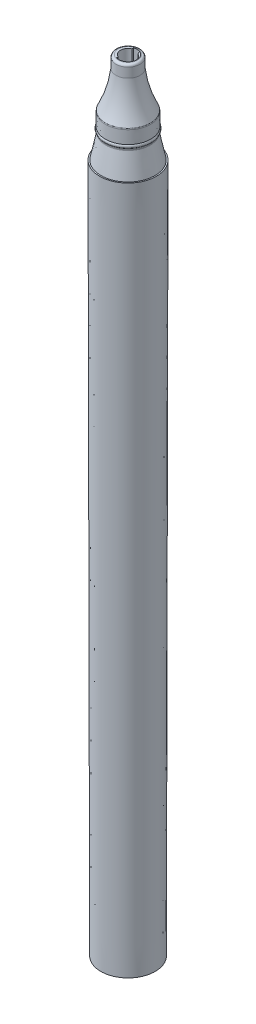
ISO-10303-21;
HEADER;
FILE_DESCRIPTION(('STEP AP214'),'2;1');
FILE_NAME('part.step','',(''),(''),'','','');
FILE_SCHEMA(('AUTOMOTIVE_DESIGN { 1 0 10303 214 1 1 1 1 }'));
ENDSEC;
DATA;
#1=APPLICATION_CONTEXT('core data for automotive mechanical design processes');
#2=APPLICATION_PROTOCOL_DEFINITION('international standard','automotive_design',2000,#1);
#3=PRODUCT_CONTEXT('',#1,'mechanical');
#4=PRODUCT('Part','Part','',(#3));
#5=PRODUCT_RELATED_PRODUCT_CATEGORY('part','',(#4));
#6=PRODUCT_DEFINITION_FORMATION('','',#4);
#7=PRODUCT_DEFINITION_CONTEXT('part definition',#1,'design');
#8=PRODUCT_DEFINITION('design','',#6,#7);
#9=PRODUCT_DEFINITION_SHAPE('','',#8);
#10=(LENGTH_UNIT() NAMED_UNIT(*) SI_UNIT(.MILLI.,.METRE.));
#11=(NAMED_UNIT(*) PLANE_ANGLE_UNIT() SI_UNIT($,.RADIAN.));
#12=(NAMED_UNIT(*) SI_UNIT($,.STERADIAN.) SOLID_ANGLE_UNIT());
#13=UNCERTAINTY_MEASURE_WITH_UNIT(LENGTH_MEASURE(1.E-05),#10,'distance_accuracy_value','');
#14=(GEOMETRIC_REPRESENTATION_CONTEXT(3) GLOBAL_UNCERTAINTY_ASSIGNED_CONTEXT((#13)) GLOBAL_UNIT_ASSIGNED_CONTEXT((#10,
#11,#12)) REPRESENTATION_CONTEXT('',''));
#15=CARTESIAN_POINT('',(0.,0.,0.));
#16=DIRECTION('',(0.,0.,1.));
#17=DIRECTION('',(1.,0.,0.));
#18=AXIS2_PLACEMENT_3D('',#15,#16,#17);
#19=CARTESIAN_POINT('',(29.567816034279,0.00621231461375715,0.));
#20=DIRECTION('',(0.,-1.,0.));
#21=DIRECTION('',(0.,0.,-1.));
#22=AXIS2_PLACEMENT_3D('',#19,#20,#21);
#23=CYLINDRICAL_SURFACE('',#22,1.49999999998157);
#24=DIRECTION('',(0.,1.,0.));
#25=VECTOR('',#24,1.);
#26=CARTESIAN_POINT('',(29.067816034279,127.906212314614,1.41421356237309));
#27=LINE('',#26,#25);
#28=CARTESIAN_POINT('',(29.067816034279,127.906212314981,1.41421356235355));
#29=VERTEX_POINT('',#28);
#30=CARTESIAN_POINT('',(29.0678160342851,129.906212314614,1.41421356235572));
#31=VERTEX_POINT('',#30);
#32=EDGE_CURVE('E155',#29,#31,#27,.T.);
#33=ORIENTED_EDGE('',*,*,#32,.T.);
#34=CARTESIAN_POINT('',(29.567816034279,129.906212314614,0.));
#35=DIRECTION('',(0.,-1.,0.));
#36=DIRECTION('',(0.,0.,-1.));
#37=AXIS2_PLACEMENT_3D('',#34,#35,#36);
#38=CIRCLE('',#37,1.49999999998157);
#39=CARTESIAN_POINT('',(30.067816034279,129.906212314614,1.41421356235355));
#40=VERTEX_POINT('',#39);
#41=EDGE_CURVE('E359',#40,#31,#38,.T.);
#42=ORIENTED_EDGE('',*,*,#41,.F.);
#43=DIRECTION('',(0.,1.,0.));
#44=VECTOR('',#43,1.);
#45=CARTESIAN_POINT('',(30.067816034279,127.906212314614,1.41421356237309));
#46=LINE('',#45,#44);
#47=CARTESIAN_POINT('',(30.067816034279,127.906212314614,1.41421356237309));
#48=VERTEX_POINT('',#47);
#49=EDGE_CURVE('E180',#48,#40,#46,.T.);
#50=ORIENTED_EDGE('',*,*,#49,.F.);
#51=CARTESIAN_POINT('',(29.567816034279,127.906212314981,0.));
#52=DIRECTION('',(0.,-1.,0.));
#53=DIRECTION('',(0.,0.,-1.));
#54=AXIS2_PLACEMENT_3D('',#51,#52,#53);
#55=CIRCLE('',#54,1.49999999998157);
#56=EDGE_CURVE('E360',#48,#29,#55,.T.);
#57=ORIENTED_EDGE('',*,*,#56,.T.);
#58=EDGE_LOOP('',(#33,#42,#50,#57));
#59=FACE_BOUND('',#58,.T.);
#60=ADVANCED_FACE('F41',(#59),#23,.F.);
#61=CARTESIAN_POINT('',(29.567816034279,114.236212314614,0.));
#62=DIRECTION('',(0.,1.,0.));
#63=DIRECTION('',(0.,0.,1.));
#64=AXIS2_PLACEMENT_3D('',#61,#62,#63);
#65=CONICAL_SURFACE('',#64,3.17500000000003,0.00418365950988951);
#66=CARTESIAN_POINT('',(29.567816034279,121.910496937969,0.));
#67=DIRECTION('',(0.,-1.,0.));
#68=DIRECTION('',(0.,0.,-1.));
#69=AXIS2_PLACEMENT_3D('',#66,#67,#68);
#70=CIRCLE('',#69,3.20710678116809);
#71=CARTESIAN_POINT('',(29.567816034279,121.910496937969,-3.20710678116809));
#72=VERTEX_POINT('',#71);
#73=EDGE_CURVE('E175',#72,#72,#70,.T.);
#74=ORIENTED_EDGE('',*,*,#73,.F.);
#75=EDGE_LOOP('',(#74));
#76=FACE_BOUND('',#75,.T.);
#77=CARTESIAN_POINT('',(29.567816034279,114.236212314614,0.));
#78=DIRECTION('',(0.,-1.,0.));
#79=DIRECTION('',(0.,0.,-1.));
#80=AXIS2_PLACEMENT_3D('',#77,#78,#79);
#81=CIRCLE('',#80,3.17500000000003);
#82=CARTESIAN_POINT('',(29.567816034279,114.236212314614,-3.17500000000003));
#83=VERTEX_POINT('',#82);
#84=EDGE_CURVE('E382',#83,#83,#81,.T.);
#85=ORIENTED_EDGE('',*,*,#84,.T.);
#86=EDGE_LOOP('',(#85));
#87=FACE_BOUND('',#86,.T.);
#88=ADVANCED_FACE('F300',(#76,#87),#65,.F.);
#89=CARTESIAN_POINT('',(29.567816034279,16.5861917853782,0.));
#90=DIRECTION('',(0.,-1.,0.));
#91=DIRECTION('',(0.,0.,-1.));
#92=AXIS2_PLACEMENT_3D('',#89,#90,#91);
#93=CONICAL_SURFACE('',#92,3.31000000000003,0.00138248730784819);
#94=ORIENTED_EDGE('',*,*,#84,.F.);
#95=EDGE_LOOP('',(#94));
#96=FACE_BOUND('',#95,.T.);
#97=CARTESIAN_POINT('',(29.567816034279,16.5861917853782,0.));
#98=DIRECTION('',(0.,-1.,0.));
#99=DIRECTION('',(0.,0.,-1.));
#100=AXIS2_PLACEMENT_3D('',#97,#98,#99);
#101=CIRCLE('',#100,3.31000000000003);
#102=CARTESIAN_POINT('',(29.567816034279,16.5861917853782,-3.31000000000003));
#103=VERTEX_POINT('',#102);
#104=EDGE_CURVE('E387',#103,#103,#101,.T.);
#105=ORIENTED_EDGE('',*,*,#104,.T.);
#106=EDGE_LOOP('',(#105));
#107=FACE_BOUND('',#106,.T.);
#108=ADVANCED_FACE('F296',(#96,#107),#93,.F.);
#109=CARTESIAN_POINT('',(29.567816034279,11.1062123146138,0.));
#110=DIRECTION('',(0.,-1.,0.));
#111=DIRECTION('',(0.,0.,-1.));
#112=AXIS2_PLACEMENT_3D('',#109,#110,#111);
#113=CONICAL_SURFACE('',#112,3.32500000000002,0.00273722969545193);
#114=ORIENTED_EDGE('',*,*,#104,.F.);
#115=EDGE_LOOP('',(#114));
#116=FACE_BOUND('',#115,.T.);
#117=CARTESIAN_POINT('',(29.567816034279,11.1062123146138,0.));
#118=DIRECTION('',(0.,-1.,0.));
#119=DIRECTION('',(0.,0.,-1.));
#120=AXIS2_PLACEMENT_3D('',#117,#118,#119);
#121=CIRCLE('',#120,3.32500000000002);
#122=CARTESIAN_POINT('',(29.567816034279,11.1062123146138,-3.32500000000002));
#123=VERTEX_POINT('',#122);
#124=EDGE_CURVE('E393',#123,#123,#121,.T.);
#125=ORIENTED_EDGE('',*,*,#124,.T.);
#126=EDGE_LOOP('',(#125));
#127=FACE_BOUND('',#126,.T.);
#128=ADVANCED_FACE('F292',(#116,#127),#113,.F.);
#129=CARTESIAN_POINT('',(0.,11.1062123146138,0.));
#130=DIRECTION('',(0.,1.,0.));
#131=DIRECTION('',(0.,0.,1.));
#132=AXIS2_PLACEMENT_3D('',#129,#130,#131);
#133=PLANE('',#132);
#134=ORIENTED_EDGE('',*,*,#124,.F.);
#135=EDGE_LOOP('',(#134));
#136=FACE_BOUND('',#135,.T.);
#137=CARTESIAN_POINT('',(29.567816034279,11.1062123146138,0.));
#138=DIRECTION('',(0.,-1.,0.));
#139=DIRECTION('',(0.,0.,-1.));
#140=AXIS2_PLACEMENT_3D('',#137,#138,#139);
#141=CIRCLE('',#140,3.39000000000003);
#142=CARTESIAN_POINT('',(29.567816034279,11.1062123146138,-3.39000000000003));
#143=VERTEX_POINT('',#142);
#144=EDGE_CURVE('E397',#143,#143,#141,.T.);
#145=ORIENTED_EDGE('',*,*,#144,.T.);
#146=EDGE_LOOP('',(#145));
#147=FACE_BOUND('',#146,.T.);
#148=ADVANCED_FACE('F288',(#136,#147),#133,.F.);
#149=CARTESIAN_POINT('',(29.567816034279,0.00621231461375715,0.));
#150=DIRECTION('',(0.,-1.,0.));
#151=DIRECTION('',(0.,0.,-1.));
#152=AXIS2_PLACEMENT_3D('',#149,#150,#151);
#153=CYLINDRICAL_SURFACE('',#152,3.39000000000003);
#154=ORIENTED_EDGE('',*,*,#144,.F.);
#155=EDGE_LOOP('',(#154));
#156=FACE_BOUND('',#155,.T.);
#157=CARTESIAN_POINT('',(29.567816034279,8.5062123146139,0.));
#158=DIRECTION('',(0.,-1.,0.));
#159=DIRECTION('',(0.,0.,-1.));
#160=AXIS2_PLACEMENT_3D('',#157,#158,#159);
#161=CIRCLE('',#160,3.39000000000003);
#162=CARTESIAN_POINT('',(29.567816034279,8.5062123146139,-3.39000000000003));
#163=VERTEX_POINT('',#162);
#164=EDGE_CURVE('E401',#163,#163,#161,.T.);
#165=ORIENTED_EDGE('',*,*,#164,.T.);
#166=EDGE_LOOP('',(#165));
#167=FACE_BOUND('',#166,.T.);
#168=ADVANCED_FACE('F284',(#156,#167),#153,.F.);
#169=CARTESIAN_POINT('',(0.,8.5062123146139,0.));
#170=DIRECTION('',(0.,-1.,0.));
#171=DIRECTION('',(0.,0.,-1.));
#172=AXIS2_PLACEMENT_3D('',#169,#170,#171);
#173=PLANE('',#172);
#174=ORIENTED_EDGE('',*,*,#164,.F.);
#175=EDGE_LOOP('',(#174));
#176=FACE_BOUND('',#175,.T.);
#177=CARTESIAN_POINT('',(29.567816034279,8.5062123146139,0.));
#178=DIRECTION('',(0.,-1.,0.));
#179=DIRECTION('',(0.,0.,-1.));
#180=AXIS2_PLACEMENT_3D('',#177,#178,#179);
#181=CIRCLE('',#180,3.32500000000002);
#182=CARTESIAN_POINT('',(29.567816034279,8.5062123146139,-3.32500000000002));
#183=VERTEX_POINT('',#182);
#184=EDGE_CURVE('E405',#183,#183,#181,.T.);
#185=ORIENTED_EDGE('',*,*,#184,.T.);
#186=EDGE_LOOP('',(#185));
#187=FACE_BOUND('',#186,.T.);
#188=ADVANCED_FACE('F280',(#176,#187),#173,.F.);
#189=CARTESIAN_POINT('',(29.567816034279,0.00621231461375715,0.));
#190=DIRECTION('',(0.,-1.,0.));
#191=DIRECTION('',(0.,0.,-1.));
#192=AXIS2_PLACEMENT_3D('',#189,#190,#191);
#193=CYLINDRICAL_SURFACE('',#192,3.32500000000002);
#194=ORIENTED_EDGE('',*,*,#184,.F.);
#195=EDGE_LOOP('',(#194));
#196=FACE_BOUND('',#195,.T.);
#197=CARTESIAN_POINT('',(29.567816034279,5.80621231461376,0.));
#198=DIRECTION('',(0.,-1.,0.));
#199=DIRECTION('',(0.,0.,-1.));
#200=AXIS2_PLACEMENT_3D('',#197,#198,#199);
#201=CIRCLE('',#200,3.32500000000002);
#202=CARTESIAN_POINT('',(29.567816034279,5.80621231461376,-3.32500000000002));
#203=VERTEX_POINT('',#202);
#204=EDGE_CURVE('E409',#203,#203,#201,.T.);
#205=ORIENTED_EDGE('',*,*,#204,.T.);
#206=EDGE_LOOP('',(#205));
#207=FACE_BOUND('',#206,.T.);
#208=ADVANCED_FACE('F276',(#196,#207),#193,.F.);
#209=CARTESIAN_POINT('',(0.,5.80621231461376,0.));
#210=DIRECTION('',(0.,1.,0.));
#211=DIRECTION('',(0.,0.,1.));
#212=AXIS2_PLACEMENT_3D('',#209,#210,#211);
#213=PLANE('',#212);
#214=ORIENTED_EDGE('',*,*,#204,.F.);
#215=EDGE_LOOP('',(#214));
#216=FACE_BOUND('',#215,.T.);
#217=CARTESIAN_POINT('',(29.567816034279,5.80621231461376,0.));
#218=DIRECTION('',(0.,-1.,0.));
#219=DIRECTION('',(0.,0.,-1.));
#220=AXIS2_PLACEMENT_3D('',#217,#218,#219);
#221=CIRCLE('',#220,3.39000000000003);
#222=CARTESIAN_POINT('',(29.567816034279,5.80621231461376,-3.39000000000003));
#223=VERTEX_POINT('',#222);
#224=EDGE_CURVE('E413',#223,#223,#221,.T.);
#225=ORIENTED_EDGE('',*,*,#224,.T.);
#226=EDGE_LOOP('',(#225));
#227=FACE_BOUND('',#226,.T.);
#228=ADVANCED_FACE('F272',(#216,#227),#213,.F.);
#229=CARTESIAN_POINT('',(29.567816034279,0.00621231461375715,0.));
#230=DIRECTION('',(0.,-1.,0.));
#231=DIRECTION('',(0.,0.,-1.));
#232=AXIS2_PLACEMENT_3D('',#229,#230,#231);
#233=CYLINDRICAL_SURFACE('',#232,3.39000000000003);
#234=ORIENTED_EDGE('',*,*,#224,.F.);
#235=EDGE_LOOP('',(#234));
#236=FACE_BOUND('',#235,.T.);
#237=CARTESIAN_POINT('',(29.567816034279,3.20621231461392,0.));
#238=DIRECTION('',(0.,-1.,0.));
#239=DIRECTION('',(0.,0.,-1.));
#240=AXIS2_PLACEMENT_3D('',#237,#238,#239);
#241=CIRCLE('',#240,3.39000000000003);
#242=CARTESIAN_POINT('',(29.567816034279,3.20621231461392,-3.39000000000003));
#243=VERTEX_POINT('',#242);
#244=EDGE_CURVE('E417',#243,#243,#241,.T.);
#245=ORIENTED_EDGE('',*,*,#244,.T.);
#246=EDGE_LOOP('',(#245));
#247=FACE_BOUND('',#246,.T.);
#248=ADVANCED_FACE('F268',(#236,#247),#233,.F.);
#249=CARTESIAN_POINT('',(0.,3.20621231461392,0.));
#250=DIRECTION('',(0.,-1.,0.));
#251=DIRECTION('',(0.,0.,-1.));
#252=AXIS2_PLACEMENT_3D('',#249,#250,#251);
#253=PLANE('',#252);
#254=ORIENTED_EDGE('',*,*,#244,.F.);
#255=EDGE_LOOP('',(#254));
#256=FACE_BOUND('',#255,.T.);
#257=CARTESIAN_POINT('',(29.567816034279,3.20621231461392,0.));
#258=DIRECTION('',(0.,-1.,0.));
#259=DIRECTION('',(0.,0.,-1.));
#260=AXIS2_PLACEMENT_3D('',#257,#258,#259);
#261=CIRCLE('',#260,3.35000000000002);
#262=CARTESIAN_POINT('',(29.567816034279,3.20621231461392,-3.35000000000002));
#263=VERTEX_POINT('',#262);
#264=EDGE_CURVE('E421',#263,#263,#261,.T.);
#265=ORIENTED_EDGE('',*,*,#264,.T.);
#266=EDGE_LOOP('',(#265));
#267=FACE_BOUND('',#266,.T.);
#268=ADVANCED_FACE('F264',(#256,#267),#253,.F.);
#269=CARTESIAN_POINT('',(29.567816034279,0.00621231461375715,0.));
#270=DIRECTION('',(0.,-1.,0.));
#271=DIRECTION('',(0.,0.,-1.));
#272=AXIS2_PLACEMENT_3D('',#269,#270,#271);
#273=CYLINDRICAL_SURFACE('',#272,3.35000000000002);
#274=ORIENTED_EDGE('',*,*,#264,.F.);
#275=EDGE_LOOP('',(#274));
#276=FACE_BOUND('',#275,.T.);
#277=CARTESIAN_POINT('',(29.567816034279,0.50621231461391,0.));
#278=DIRECTION('',(0.,-1.,0.));
#279=DIRECTION('',(0.,0.,-1.));
#280=AXIS2_PLACEMENT_3D('',#277,#278,#279);
#281=CIRCLE('',#280,3.35000000000002);
#282=CARTESIAN_POINT('',(29.567816034279,0.50621231461391,-3.35000000000002));
#283=VERTEX_POINT('',#282);
#284=EDGE_CURVE('E425',#283,#283,#281,.T.);
#285=ORIENTED_EDGE('',*,*,#284,.T.);
#286=EDGE_LOOP('',(#285));
#287=FACE_BOUND('',#286,.T.);
#288=ADVANCED_FACE('F260',(#276,#287),#273,.F.);
#289=CARTESIAN_POINT('',(0.,0.50621231461391,0.));
#290=DIRECTION('',(0.,-1.,0.));
#291=DIRECTION('',(0.,0.,-1.));
#292=AXIS2_PLACEMENT_3D('',#289,#290,#291);
#293=PLANE('',#292);
#294=CARTESIAN_POINT('',(29.567816034279,0.50621231461391,0.));
#295=DIRECTION('',(0.,-1.,0.));
#296=DIRECTION('',(0.,0.,-1.));
#297=AXIS2_PLACEMENT_3D('',#294,#295,#296);
#298=CIRCLE('',#297,3.92500000000003);
#299=CARTESIAN_POINT('',(29.567816034279,0.50621231461391,-3.92500000000003));
#300=VERTEX_POINT('',#299);
#301=EDGE_CURVE('E429',#300,#300,#298,.T.);
#302=ORIENTED_EDGE('',*,*,#301,.T.);
#303=EDGE_LOOP('',(#302));
#304=FACE_BOUND('',#303,.T.);
#305=ORIENTED_EDGE('',*,*,#284,.F.);
#306=EDGE_LOOP('',(#305));
#307=FACE_BOUND('',#306,.T.);
#308=ADVANCED_FACE('F256',(#304,#307),#293,.T.);
#309=CARTESIAN_POINT('',(29.567816034279,0.50621231461391,0.));
#310=DIRECTION('',(0.,-1.,0.));
#311=DIRECTION('',(0.,0.,-1.));
#312=AXIS2_PLACEMENT_3D('',#309,#310,#311);
#313=CONICAL_SURFACE('',#312,3.92500000000003,0.0523598775597028);
#314=CARTESIAN_POINT('',(29.567816034279,0.000953551691870738,0.));
#315=DIRECTION('',(0.,-1.,0.));
#316=DIRECTION('',(0.,0.,-1.));
#317=AXIS2_PLACEMENT_3D('',#314,#315,#316);
#318=CIRCLE('',#317,3.95147948972801);
#319=CARTESIAN_POINT('',(29.567816034279,0.000953551691870738,-3.95147948972801));
#320=VERTEX_POINT('',#319);
#321=EDGE_CURVE('E433',#320,#320,#318,.T.);
#322=ORIENTED_EDGE('',*,*,#321,.T.);
#323=EDGE_LOOP('',(#322));
#324=FACE_BOUND('',#323,.T.);
#325=ORIENTED_EDGE('',*,*,#301,.F.);
#326=EDGE_LOOP('',(#325));
#327=FACE_BOUND('',#326,.T.);
#328=ADVANCED_FACE('F252',(#324,#327),#313,.F.);
#329=CARTESIAN_POINT('',(29.567816034279,0.000953551691870738,0.));
#330=DIRECTION('',(0.,-1.,0.));
#331=DIRECTION('',(0.,0.,-1.));
#332=AXIS2_PLACEMENT_3D('',#329,#330,#331);
#333=CONICAL_SURFACE('',#332,3.95147948972801,1.56913369572546);
#334=CARTESIAN_POINT('',(29.567816034279,-3.67220143182578E-10,0.));
#335=DIRECTION('',(0.,-1.,0.));
#336=DIRECTION('',(0.,0.,-1.));
#337=AXIS2_PLACEMENT_3D('',#334,#335,#336);
#338=CIRCLE('',#337,4.524998893986);
#339=CARTESIAN_POINT('',(29.567816034279,-3.67220143182578E-10,-4.524998893986));
#340=VERTEX_POINT('',#339);
#341=EDGE_CURVE('E437',#340,#340,#338,.T.);
#342=ORIENTED_EDGE('',*,*,#341,.T.);
#343=EDGE_LOOP('',(#342));
#344=FACE_BOUND('',#343,.T.);
#345=ORIENTED_EDGE('',*,*,#321,.F.);
#346=EDGE_LOOP('',(#345));
#347=FACE_BOUND('',#346,.T.);
#348=ADVANCED_FACE('F248',(#344,#347),#333,.F.);
#349=CARTESIAN_POINT('',(29.567816034279,-3.67220143182578E-10,0.));
#350=DIRECTION('',(0.,1.,0.));
#351=DIRECTION('',(0.,0.,1.));
#352=AXIS2_PLACEMENT_3D('',#349,#350,#351);
#353=CONICAL_SURFACE('',#352,4.524998893986,0.00166263106943584);
#354=CARTESIAN_POINT('',(29.567816034279,114.706212314614,0.));
#355=DIRECTION('',(0.,-1.,0.));
#356=DIRECTION('',(0.,0.,-1.));
#357=AXIS2_PLACEMENT_3D('',#354,#355,#356);
#358=CIRCLE('',#357,4.7157131821714);
#359=CARTESIAN_POINT('',(29.567816034279,114.706212314614,-4.7157131821714));
#360=VERTEX_POINT('',#359);
#361=EDGE_CURVE('E441',#360,#360,#358,.T.);
#362=ORIENTED_EDGE('',*,*,#361,.T.);
#363=EDGE_LOOP('',(#362));
#364=FACE_BOUND('',#363,.T.);
#365=ORIENTED_EDGE('',*,*,#341,.F.);
#366=EDGE_LOOP('',(#365));
#367=FACE_BOUND('',#366,.T.);
#368=ADVANCED_FACE('F244',(#364,#367),#353,.T.);
#369=CARTESIAN_POINT('',(0.,114.706212314614,0.));
#370=DIRECTION('',(0.,-1.,0.));
#371=DIRECTION('',(0.,0.,-1.));
#372=AXIS2_PLACEMENT_3D('',#369,#370,#371);
#373=PLANE('',#372);
#374=CARTESIAN_POINT('',(29.567816034279,114.706212314614,0.));
#375=DIRECTION('',(0.,-1.,0.));
#376=DIRECTION('',(0.,0.,-1.));
#377=AXIS2_PLACEMENT_3D('',#374,#375,#376);
#378=CIRCLE('',#377,4.49839647045024);
#379=CARTESIAN_POINT('',(29.567816034279,114.706212314614,-4.49839647045024));
#380=VERTEX_POINT('',#379);
#381=EDGE_CURVE('E51',#380,#380,#378,.T.);
#382=ORIENTED_EDGE('',*,*,#381,.T.);
#383=EDGE_LOOP('',(#382));
#384=FACE_BOUND('',#383,.T.);
#385=ORIENTED_EDGE('',*,*,#361,.F.);
#386=EDGE_LOOP('',(#385));
#387=FACE_BOUND('',#386,.T.);
#388=ADVANCED_FACE('F240',(#384,#387),#373,.F.);
#389=CARTESIAN_POINT('',(29.567816034279,113.95974147737,0.));
#390=DIRECTION('',(0.,-1.,0.));
#391=DIRECTION('',(0.,0.,-1.));
#392=AXIS2_PLACEMENT_3D('',#389,#390,#391);
#393=DEGENERATE_TOROIDAL_SURFACE('',#392,71.1713068215919,75.,.F.);
#394=CARTESIAN_POINT('',(29.567816034279,118.662812367333,0.));
#395=DIRECTION('',(0.,-1.,0.));
#396=DIRECTION('',(0.,0.,-1.));
#397=AXIS2_PLACEMENT_3D('',#394,#395,#396);
#398=CIRCLE('',#397,3.68108875933782);
#399=CARTESIAN_POINT('',(29.567816034279,118.662812367333,-3.68108875933782));
#400=VERTEX_POINT('',#399);
#401=EDGE_CURVE('E11',#400,#400,#398,.F.);
#402=ORIENTED_EDGE('',*,*,#401,.T.);
#403=EDGE_LOOP('',(#402));
#404=FACE_BOUND('',#403,.T.);
#405=CARTESIAN_POINT('',(29.567816034279,118.745733306266,0.));
#406=DIRECTION('',(0.,-1.,0.));
#407=DIRECTION('',(0.,0.,-1.));
#408=AXIS2_PLACEMENT_3D('',#405,#406,#407);
#409=CIRCLE('',#408,3.6758326174926);
#410=CARTESIAN_POINT('',(29.567816034279,118.745733306266,-3.6758326174926));
#411=VERTEX_POINT('',#410);
#412=EDGE_CURVE('E445',#411,#411,#409,.T.);
#413=ORIENTED_EDGE('',*,*,#412,.T.);
#414=EDGE_LOOP('',(#413));
#415=FACE_BOUND('',#414,.T.);
#416=ADVANCED_FACE('F236',(#404,#415),#393,.F.);
#417=CARTESIAN_POINT('',(29.567816034279,118.771258596021,0.));
#418=DIRECTION('',(0.,-1.,0.));
#419=DIRECTION('',(0.,0.,-1.));
#420=AXIS2_PLACEMENT_3D('',#417,#418,#419);
#421=TOROIDAL_SURFACE('',#420,4.07501736118282,0.400000000015133);
#422=ORIENTED_EDGE('',*,*,#412,.F.);
#423=EDGE_LOOP('',(#422));
#424=FACE_BOUND('',#423,.T.);
#425=CARTESIAN_POINT('',(29.567816034279,119.039806822496,0.));
#426=DIRECTION('',(0.,-1.,0.));
#427=DIRECTION('',(0.,0.,-1.));
#428=AXIS2_PLACEMENT_3D('',#425,#426,#427);
#429=CIRCLE('',#428,3.77856863025525);
#430=CARTESIAN_POINT('',(29.567816034279,119.039806822496,-3.77856863025525));
#431=VERTEX_POINT('',#430);
#432=EDGE_CURVE('E449',#431,#431,#429,.T.);
#433=ORIENTED_EDGE('',*,*,#432,.T.);
#434=EDGE_LOOP('',(#433));
#435=FACE_BOUND('',#434,.T.);
#436=ADVANCED_FACE('F232',(#424,#435),#421,.F.);
#437=CARTESIAN_POINT('',(29.567816034279,119.30835504882,0.));
#438=DIRECTION('',(0.,-1.,0.));
#439=DIRECTION('',(0.,0.,-1.));
#440=AXIS2_PLACEMENT_3D('',#437,#438,#439);
#441=TOROIDAL_SURFACE('',#440,3.48211989921324,0.399999999998108);
#442=ORIENTED_EDGE('',*,*,#432,.F.);
#443=EDGE_LOOP('',(#442));
#444=FACE_BOUND('',#443,.T.);
#445=CARTESIAN_POINT('',(29.567816034279,119.583193369398,0.));
#446=DIRECTION('',(0.,-1.,0.));
#447=DIRECTION('',(0.,0.,-1.));
#448=AXIS2_PLACEMENT_3D('',#445,#446,#447);
#449=CIRCLE('',#448,3.77274663153745);
#450=CARTESIAN_POINT('',(29.567816034279,119.583193369398,-3.77274663153745));
#451=VERTEX_POINT('',#450);
#452=EDGE_CURVE('E453',#451,#451,#449,.T.);
#453=ORIENTED_EDGE('',*,*,#452,.T.);
#454=EDGE_LOOP('',(#453));
#455=FACE_BOUND('',#454,.T.);
#456=ADVANCED_FACE('F228',(#444,#455),#441,.T.);
#457=CARTESIAN_POINT('',(29.567816034279,121.706212314614,0.));
#458=DIRECTION('',(0.,-1.,0.));
#459=DIRECTION('',(0.,0.,-1.));
#460=AXIS2_PLACEMENT_3D('',#457,#458,#459);
#461=CONICAL_SURFACE('',#460,3.74999999998154,0.0107138757571123);
#462=ORIENTED_EDGE('',*,*,#452,.F.);
#463=EDGE_LOOP('',(#462));
#464=FACE_BOUND('',#463,.T.);
#465=CARTESIAN_POINT('',(29.567816034279,121.706212314614,0.));
#466=DIRECTION('',(0.,-1.,0.));
#467=DIRECTION('',(0.,0.,-1.));
#468=AXIS2_PLACEMENT_3D('',#465,#466,#467);
#469=CIRCLE('',#468,3.74999999998154);
#470=CARTESIAN_POINT('',(29.567816034279,121.706212314614,-3.74999999998154));
#471=VERTEX_POINT('',#470);
#472=EDGE_CURVE('E457',#471,#471,#469,.T.);
#473=ORIENTED_EDGE('',*,*,#472,.T.);
#474=EDGE_LOOP('',(#473));
#475=FACE_BOUND('',#474,.T.);
#476=ADVANCED_FACE('F224',(#464,#475),#461,.T.);
#477=CARTESIAN_POINT('',(29.567816034279,121.707212364619,0.));
#478=DIRECTION('',(0.,-1.,0.));
#479=DIRECTION('',(0.,0.,-1.));
#480=AXIS2_PLACEMENT_3D('',#477,#478,#479);
#481=TOROIDAL_SURFACE('',#480,2.75000050003171,0.999999999999965);
#482=CARTESIAN_POINT('',(29.567816034279,121.906212314614,0.));
#483=DIRECTION('',(0.,-1.,0.));
#484=DIRECTION('',(0.,0.,-1.));
#485=AXIS2_PLACEMENT_3D('',#482,#483,#484);
#486=CIRCLE('',#485,3.72999999998155);
#487=CARTESIAN_POINT('',(29.567816034279,121.906212314614,-3.72999999998155));
#488=VERTEX_POINT('',#487);
#489=EDGE_CURVE('E461',#488,#488,#486,.T.);
#490=ORIENTED_EDGE('',*,*,#489,.T.);
#491=EDGE_LOOP('',(#490));
#492=FACE_BOUND('',#491,.T.);
#493=ORIENTED_EDGE('',*,*,#472,.F.);
#494=EDGE_LOOP('',(#493));
#495=FACE_BOUND('',#494,.T.);
#496=ADVANCED_FACE('F220',(#492,#495),#481,.T.);
#497=CARTESIAN_POINT('',(29.567816034279,129.791304012019,0.));
#498=DIRECTION('',(0.,-1.,0.));
#499=DIRECTION('',(0.,0.,-1.));
#500=AXIS2_PLACEMENT_3D('',#497,#498,#499);
#501=TOROIDAL_SURFACE('',#500,19.911017549059,18.0000000000007);
#502=ORIENTED_EDGE('',*,*,#489,.F.);
#503=EDGE_LOOP('',(#502));
#504=FACE_BOUND('',#503,.T.);
#505=CARTESIAN_POINT('',(29.567816034279,127.906212314614,0.));
#506=DIRECTION('',(0.,-1.,0.));
#507=DIRECTION('',(0.,0.,-1.));
#508=AXIS2_PLACEMENT_3D('',#505,#506,#507);
#509=CIRCLE('',#508,2.00999999998139);
#510=CARTESIAN_POINT('',(29.567816034279,127.906212314614,-2.00999999998139));
#511=VERTEX_POINT('',#510);
#512=EDGE_CURVE('E465',#511,#511,#509,.T.);
#513=ORIENTED_EDGE('',*,*,#512,.T.);
#514=EDGE_LOOP('',(#513));
#515=FACE_BOUND('',#514,.T.);
#516=ADVANCED_FACE('F216',(#504,#515),#501,.F.);
#517=CARTESIAN_POINT('',(29.567816034279,0.00621231461375715,0.));
#518=DIRECTION('',(0.,-1.,0.));
#519=DIRECTION('',(0.,0.,-1.));
#520=AXIS2_PLACEMENT_3D('',#517,#518,#519);
#521=CYLINDRICAL_SURFACE('',#520,2.00999999998148);
#522=CARTESIAN_POINT('',(29.567816034279,129.506212314614,0.));
#523=DIRECTION('',(0.,-1.,0.));
#524=DIRECTION('',(0.,0.,-1.));
#525=AXIS2_PLACEMENT_3D('',#522,#523,#524);
#526=CIRCLE('',#525,2.00999999998158);
#527=CARTESIAN_POINT('',(29.567816034279,129.506212314614,-2.00999999998158));
#528=VERTEX_POINT('',#527);
#529=EDGE_CURVE('E469',#528,#528,#526,.T.);
#530=ORIENTED_EDGE('',*,*,#529,.T.);
#531=EDGE_LOOP('',(#530));
#532=FACE_BOUND('',#531,.T.);
#533=ORIENTED_EDGE('',*,*,#512,.F.);
#534=EDGE_LOOP('',(#533));
#535=FACE_BOUND('',#534,.T.);
#536=ADVANCED_FACE('F212',(#532,#535),#521,.T.);
#537=CARTESIAN_POINT('',(29.567816034279,129.506212314614,0.));
#538=DIRECTION('',(0.,-1.,0.));
#539=DIRECTION('',(0.,0.,-1.));
#540=AXIS2_PLACEMENT_3D('',#537,#538,#539);
#541=TOROIDAL_SURFACE('',#540,1.60999999998157,0.400000000000011);
#542=CARTESIAN_POINT('',(29.567816034279,129.906212314614,0.));
#543=DIRECTION('',(0.,-1.,0.));
#544=DIRECTION('',(0.,0.,-1.));
#545=AXIS2_PLACEMENT_3D('',#542,#543,#544);
#546=CIRCLE('',#545,1.60999999998157);
#547=CARTESIAN_POINT('',(29.567816034279,129.906212314614,-1.60999999998157));
#548=VERTEX_POINT('',#547);
#549=EDGE_CURVE('E369',#548,#548,#546,.T.);
#550=ORIENTED_EDGE('',*,*,#549,.T.);
#551=EDGE_LOOP('',(#550));
#552=FACE_BOUND('',#551,.T.);
#553=ORIENTED_EDGE('',*,*,#529,.F.);
#554=EDGE_LOOP('',(#553));
#555=FACE_BOUND('',#554,.T.);
#556=ADVANCED_FACE('F208',(#552,#555),#541,.T.);
#557=CARTESIAN_POINT('',(0.,129.906212314614,0.));
#558=DIRECTION('',(0.,1.,0.));
#559=DIRECTION('',(0.,0.,1.));
#560=AXIS2_PLACEMENT_3D('',#557,#558,#559);
#561=PLANE('',#560);
#562=CARTESIAN_POINT('',(29.067816034279,129.906212314614,-1.41421356235355));
#563=VERTEX_POINT('',#562);
#564=CARTESIAN_POINT('',(30.0678160342728,129.906212314614,-1.41421356235572));
#565=VERTEX_POINT('',#564);
#566=EDGE_CURVE('E370',#563,#565,#38,.T.);
#567=ORIENTED_EDGE('',*,*,#566,.T.);
#568=CARTESIAN_POINT('',(29.567816034279,129.906212314614,0.));
#569=DIRECTION('',(0.,1.,0.));
#570=DIRECTION('',(0.,0.,1.));
#571=AXIS2_PLACEMENT_3D('',#568,#569,#570);
#572=CIRCLE('',#571,1.5);
#573=EDGE_CURVE('E367',#565,#40,#572,.F.);
#574=ORIENTED_EDGE('',*,*,#573,.T.);
#575=ORIENTED_EDGE('',*,*,#41,.T.);
#576=DIRECTION('',(0.,0.,-1.));
#577=VECTOR('',#576,1.);
#578=CARTESIAN_POINT('',(29.067816034279,129.906212314614,1.41421356237309));
#579=LINE('',#578,#577);
#580=CARTESIAN_POINT('',(29.067816034279,129.906212314614,1.14564392373896));
#581=VERTEX_POINT('',#580);
#582=EDGE_CURVE('E136',#31,#581,#579,.T.);
#583=ORIENTED_EDGE('',*,*,#582,.T.);
#584=CARTESIAN_POINT('',(29.567816034279,129.906212314614,0.));
#585=DIRECTION('',(0.,-1.,0.));
#586=DIRECTION('',(-1.,0.,0.));
#587=AXIS2_PLACEMENT_3D('',#584,#585,#586);
#588=CIRCLE('',#587,1.25);
#589=CARTESIAN_POINT('',(29.067816034279,129.906212314614,-1.14564392373896));
#590=VERTEX_POINT('',#589);
#591=EDGE_CURVE('E147',#581,#590,#588,.T.);
#592=ORIENTED_EDGE('',*,*,#591,.T.);
#593=DIRECTION('',(0.,0.,-1.));
#594=VECTOR('',#593,1.);
#595=CARTESIAN_POINT('',(29.067816034279,129.906212314614,-1.14564392373896));
#596=LINE('',#595,#594);
#597=EDGE_CURVE('E114',#590,#563,#596,.T.);
#598=ORIENTED_EDGE('',*,*,#597,.T.);
#599=EDGE_LOOP('',(#567,#574,#575,#583,#592,#598));
#600=FACE_BOUND('',#599,.T.);
#601=ORIENTED_EDGE('',*,*,#549,.F.);
#602=EDGE_LOOP('',(#601));
#603=FACE_BOUND('',#602,.T.);
#604=ADVANCED_FACE('F204',(#600,#603),#561,.T.);
#605=DIRECTION('',(0.,1.,0.));
#606=VECTOR('',#605,1.);
#607=CARTESIAN_POINT('',(29.067816034279,127.906212314614,-1.41421356237309));
#608=LINE('',#607,#606);
#609=CARTESIAN_POINT('',(29.067816034279,127.906212314614,-1.41421356237309));
#610=VERTEX_POINT('',#609);
#611=EDGE_CURVE('E120',#610,#563,#608,.T.);
#612=ORIENTED_EDGE('',*,*,#611,.F.);
#613=CARTESIAN_POINT('',(30.067816034279,127.906212314981,-1.41421356235355));
#614=VERTEX_POINT('',#613);
#615=EDGE_CURVE('E377',#610,#614,#55,.T.);
#616=ORIENTED_EDGE('',*,*,#615,.T.);
#617=DIRECTION('',(0.,1.,0.));
#618=VECTOR('',#617,1.);
#619=CARTESIAN_POINT('',(30.067816034279,127.906212314614,-1.41421356237309));
#620=LINE('',#619,#618);
#621=EDGE_CURVE('E176',#614,#565,#620,.T.);
#622=ORIENTED_EDGE('',*,*,#621,.T.);
#623=ORIENTED_EDGE('',*,*,#566,.F.);
#624=EDGE_LOOP('',(#612,#616,#622,#623));
#625=FACE_BOUND('',#624,.T.);
#626=ADVANCED_FACE('F199',(#625),#23,.F.);
#627=CARTESIAN_POINT('',(31.0678160342606,127.906212314981,0.));
#628=CARTESIAN_POINT('',(31.1596244141035,127.037730670578,0.));
#629=CARTESIAN_POINT('',(31.3928304258709,125.33067788015,0.));
#630=CARTESIAN_POINT('',(31.7252149418012,123.68344608648,0.));
#631=CARTESIAN_POINT('',(31.916201825807,122.874785438834,0.));
#632=B_SPLINE_CURVE_WITH_KNOTS('',3,(#627,#628,#629,#630,#631),.UNSPECIFIED.,.F.,.F.,(4,1,4),
(0.,0.486102122719795,0.97220424543959),.UNSPECIFIED.);
#633=CARTESIAN_POINT('',(29.567816034279,0.00621231461375715,0.));
#634=DIRECTION('',(0.,-1.,0.));
#635=AXIS1_PLACEMENT('',#633,#634);
#636=SURFACE_OF_REVOLUTION('',#632,#635);
#637=CARTESIAN_POINT('',(29.567816034279,122.874785438834,0.));
#638=DIRECTION('',(0.,-1.,0.));
#639=DIRECTION('',(0.,0.,-1.));
#640=AXIS2_PLACEMENT_3D('',#637,#638,#639);
#641=CIRCLE('',#640,2.34838579152805);
#642=CARTESIAN_POINT('',(29.567816034279,122.874785438834,-2.34838579152805));
#643=VERTEX_POINT('',#642);
#644=EDGE_CURVE('E479',#643,#643,#641,.T.);
#645=ORIENTED_EDGE('',*,*,#644,.T.);
#646=EDGE_LOOP('',(#645));
#647=FACE_BOUND('',#646,.T.);
#648=EDGE_CURVE('E375',#614,#48,#55,.T.);
#649=ORIENTED_EDGE('',*,*,#648,.F.);
#650=ORIENTED_EDGE('',*,*,#615,.F.);
#651=CARTESIAN_POINT('',(29.567816034279,127.906212314614,0.));
#652=DIRECTION('',(0.,1.,0.));
#653=DIRECTION('',(-1.,0.,0.));
#654=AXIS2_PLACEMENT_3D('',#651,#652,#653);
#655=CIRCLE('',#654,1.5);
#656=EDGE_CURVE('E130',#610,#29,#655,.T.);
#657=ORIENTED_EDGE('',*,*,#656,.T.);
#658=ORIENTED_EDGE('',*,*,#56,.F.);
#659=EDGE_LOOP('',(#649,#650,#657,#658));
#660=FACE_BOUND('',#659,.T.);
#661=ADVANCED_FACE('F194',(#647,#660),#636,.F.);
#662=CARTESIAN_POINT('',(29.567816034279,122.989712057607,0.));
#663=DIRECTION('',(0.,-1.,0.));
#664=DIRECTION('',(0.,0.,-1.));
#665=AXIS2_PLACEMENT_3D('',#662,#663,#664);
#666=TOROIDAL_SURFACE('',#665,2.83499844271734,0.500000000000001);
#667=CARTESIAN_POINT('',(29.567816034279,122.636158667013,0.));
#668=DIRECTION('',(0.,-1.,0.));
#669=DIRECTION('',(0.,0.,-1.));
#670=AXIS2_PLACEMENT_3D('',#667,#668,#669);
#671=CIRCLE('',#670,2.48144505212408);
#672=CARTESIAN_POINT('',(29.567816034279,122.636158667013,-2.48144505212408));
#673=VERTEX_POINT('',#672);
#674=EDGE_CURVE('E482',#673,#673,#671,.T.);
#675=ORIENTED_EDGE('',*,*,#674,.T.);
#676=EDGE_LOOP('',(#675));
#677=FACE_BOUND('',#676,.T.);
#678=ORIENTED_EDGE('',*,*,#644,.F.);
#679=EDGE_LOOP('',(#678));
#680=FACE_BOUND('',#679,.T.);
#681=ADVANCED_FACE('F198',(#677,#680),#666,.T.);
#682=CARTESIAN_POINT('',(29.567816034279,122.636158667013,0.));
#683=DIRECTION('',(0.,-1.,0.));
#684=DIRECTION('',(0.,0.,-1.));
#685=AXIS2_PLACEMENT_3D('',#682,#683,#684);
#686=CONICAL_SURFACE('',#685,2.48144505212408,0.785398163397448);
#687=ORIENTED_EDGE('',*,*,#73,.T.);
#688=EDGE_LOOP('',(#687));
#689=FACE_BOUND('',#688,.T.);
#690=ORIENTED_EDGE('',*,*,#674,.F.);
#691=EDGE_LOOP('',(#690));
#692=FACE_BOUND('',#691,.T.);
#693=ADVANCED_FACE('F341',(#689,#692),#686,.F.);
#694=CARTESIAN_POINT('',(29.567816034279,127.906212314614,0.));
#695=DIRECTION('',(0.,1.,0.));
#696=DIRECTION('',(-1.,0.,0.));
#697=AXIS2_PLACEMENT_3D('',#694,#695,#696);
#698=CYLINDRICAL_SURFACE('',#697,1.25);
#699=DIRECTION('',(0.,1.,0.));
#700=VECTOR('',#699,1.);
#701=CARTESIAN_POINT('',(30.067816034279,127.906212314614,1.14564392373896));
#702=LINE('',#701,#700);
#703=CARTESIAN_POINT('',(30.067816034279,127.906212314614,1.14564392373896));
#704=VERTEX_POINT('',#703);
#705=CARTESIAN_POINT('',(30.067816034279,129.656212314614,1.14564392373896));
#706=VERTEX_POINT('',#705);
#707=EDGE_CURVE('E171',#704,#706,#702,.T.);
#708=ORIENTED_EDGE('',*,*,#707,.T.);
#709=CARTESIAN_POINT('',(29.567816034279,129.656212314614,0.));
#710=DIRECTION('',(0.,1.,0.));
#711=DIRECTION('',(0.,0.,1.));
#712=AXIS2_PLACEMENT_3D('',#709,#710,#711);
#713=CIRCLE('',#712,1.25);
#714=CARTESIAN_POINT('',(30.067816034279,129.656212314614,-1.14564392373896));
#715=VERTEX_POINT('',#714);
#716=EDGE_CURVE('E58',#706,#715,#713,.T.);
#717=ORIENTED_EDGE('',*,*,#716,.T.);
#718=DIRECTION('',(0.,1.,0.));
#719=VECTOR('',#718,1.);
#720=CARTESIAN_POINT('',(30.067816034279,127.906212314614,-1.14564392373896));
#721=LINE('',#720,#719);
#722=CARTESIAN_POINT('',(30.067816034279,127.906212314614,-1.14564392373896));
#723=VERTEX_POINT('',#722);
#724=EDGE_CURVE('E172',#723,#715,#721,.T.);
#725=ORIENTED_EDGE('',*,*,#724,.F.);
#726=CARTESIAN_POINT('',(29.567816034279,127.906212314614,0.));
#727=DIRECTION('',(0.,-1.,0.));
#728=DIRECTION('',(-1.,0.,0.));
#729=AXIS2_PLACEMENT_3D('',#726,#727,#728);
#730=CIRCLE('',#729,1.25);
#731=EDGE_CURVE('E154',#723,#704,#730,.T.);
#732=ORIENTED_EDGE('',*,*,#731,.T.);
#733=EDGE_LOOP('',(#708,#717,#725,#732));
#734=FACE_BOUND('',#733,.T.);
#735=ADVANCED_FACE('F333',(#734),#698,.F.);
#736=CARTESIAN_POINT('',(30.067816034279,127.906212314614,-1.14564392373896));
#737=DIRECTION('',(-1.,0.,0.));
#738=DIRECTION('',(0.,-1.,0.));
#739=AXIS2_PLACEMENT_3D('',#736,#737,#738);
#740=PLANE('',#739);
#741=ORIENTED_EDGE('',*,*,#724,.T.);
#742=CARTESIAN_POINT('',(30.067816034279,129.656212314614,-1.14564392373896));
#743=CARTESIAN_POINT('',(30.067816034279,129.676872671565,-1.16818523077519));
#744=CARTESIAN_POINT('',(30.067816034279,129.697584992372,-1.19067880121687));
#745=CARTESIAN_POINT('',(30.067816034279,129.739099850253,-1.23558203961923));
#746=CARTESIAN_POINT('',(30.067816034279,129.759902386218,-1.25799170860469));
#747=CARTESIAN_POINT('',(30.067816034279,129.801584405172,-1.30273919710128));
#748=CARTESIAN_POINT('',(30.067816034279,129.822463887922,-1.32507701683557));
#749=CARTESIAN_POINT('',(30.067816034279,129.864290167153,-1.36969006927845));
#750=CARTESIAN_POINT('',(30.067816034279,129.885236964455,-1.39196530121803));
#751=CARTESIAN_POINT('',(30.067816034279,129.906212314614,-1.41421356237309));
#752=B_SPLINE_CURVE_WITH_KNOTS('',3,(#742,#743,#744,#745,#746,#747,#748,#749,#750,#751),
.UNSPECIFIED.,.F.,.F.,(4,2,2,2,4),(0.,0.0917311929665421,0.183461261865735,0.275191045576845,
0.366921951473681),.UNSPECIFIED.);
#753=EDGE_CURVE('E321',#715,#565,#752,.T.);
#754=ORIENTED_EDGE('',*,*,#753,.T.);
#755=ORIENTED_EDGE('',*,*,#621,.F.);
#756=DIRECTION('',(0.,0.,1.));
#757=VECTOR('',#756,1.);
#758=CARTESIAN_POINT('',(30.067816034279,127.906212314614,-1.14564392373896));
#759=LINE('',#758,#757);
#760=EDGE_CURVE('E167',#614,#723,#759,.T.);
#761=ORIENTED_EDGE('',*,*,#760,.T.);
#762=EDGE_LOOP('',(#741,#754,#755,#761));
#763=FACE_BOUND('',#762,.T.);
#764=ADVANCED_FACE('F328',(#763),#740,.T.);
#765=CARTESIAN_POINT('',(30.067816034279,127.906212314614,1.41421356237309));
#766=DIRECTION('',(-1.,0.,0.));
#767=DIRECTION('',(0.,-1.,0.));
#768=AXIS2_PLACEMENT_3D('',#765,#766,#767);
#769=PLANE('',#768);
#770=ORIENTED_EDGE('',*,*,#49,.T.);
#771=CARTESIAN_POINT('',(30.067816034279,129.906212314614,1.4142135623731));
#772=CARTESIAN_POINT('',(30.067816034279,129.885236964455,1.39196530121803));
#773=CARTESIAN_POINT('',(30.067816034279,129.864290167153,1.36969006927846));
#774=CARTESIAN_POINT('',(30.067816034279,129.822463887922,1.32507701683558));
#775=CARTESIAN_POINT('',(30.067816034279,129.801584405172,1.30273919710128));
#776=CARTESIAN_POINT('',(30.067816034279,129.759902386218,1.25799170860469));
#777=CARTESIAN_POINT('',(30.067816034279,129.739099850253,1.23558203961924));
#778=CARTESIAN_POINT('',(30.067816034279,129.697584992372,1.19067880121687));
#779=CARTESIAN_POINT('',(30.067816034279,129.676872671565,1.16818523077519));
#780=CARTESIAN_POINT('',(30.067816034279,129.656212314614,1.14564392373896));
#781=B_SPLINE_CURVE_WITH_KNOTS('',3,(#771,#772,#773,#774,#775,#776,#777,#778,#779,#780),
.UNSPECIFIED.,.F.,.F.,(4,2,2,2,4),(0.,0.0917309058968391,0.183460689607949,0.275190758507143,
0.366921951473686),.UNSPECIFIED.);
#782=EDGE_CURVE('E66',#40,#706,#781,.T.);
#783=ORIENTED_EDGE('',*,*,#782,.T.);
#784=ORIENTED_EDGE('',*,*,#707,.F.);
#785=DIRECTION('',(0.,0.,1.));
#786=VECTOR('',#785,1.);
#787=CARTESIAN_POINT('',(30.067816034279,127.906212314614,1.41421356237309));
#788=LINE('',#787,#786);
#789=EDGE_CURVE('E163',#704,#48,#788,.T.);
#790=ORIENTED_EDGE('',*,*,#789,.T.);
#791=EDGE_LOOP('',(#770,#783,#784,#790));
#792=FACE_BOUND('',#791,.T.);
#793=ADVANCED_FACE('F332',(#792),#769,.T.);
#794=CARTESIAN_POINT('',(29.567816034279,127.906212314614,0.));
#795=DIRECTION('',(0.,1.,0.));
#796=DIRECTION('',(-1.,0.,0.));
#797=AXIS2_PLACEMENT_3D('',#794,#795,#796);
#798=PLANE('',#797);
#799=ORIENTED_EDGE('',*,*,#731,.F.);
#800=ORIENTED_EDGE('',*,*,#760,.F.);
#801=ORIENTED_EDGE('',*,*,#648,.T.);
#802=ORIENTED_EDGE('',*,*,#789,.F.);
#803=EDGE_LOOP('',(#799,#800,#801,#802));
#804=FACE_BOUND('',#803,.T.);
#805=ADVANCED_FACE('F335',(#804),#798,.F.);
#806=CARTESIAN_POINT('',(29.567816034279,127.906212314614,0.));
#807=DIRECTION('',(0.,1.,0.));
#808=DIRECTION('',(-1.,0.,0.));
#809=AXIS2_PLACEMENT_3D('',#806,#807,#808);
#810=CYLINDRICAL_SURFACE('',#809,1.25);
#811=ORIENTED_EDGE('',*,*,#591,.F.);
#812=DIRECTION('',(0.,1.,0.));
#813=VECTOR('',#812,1.);
#814=CARTESIAN_POINT('',(29.067816034279,127.906212314614,1.14564392373896));
#815=LINE('',#814,#813);
#816=CARTESIAN_POINT('',(29.067816034279,127.906212314614,1.14564392373896));
#817=VERTEX_POINT('',#816);
#818=EDGE_CURVE('E134',#817,#581,#815,.T.);
#819=ORIENTED_EDGE('',*,*,#818,.F.);
#820=CARTESIAN_POINT('',(29.567816034279,127.906212314614,0.));
#821=DIRECTION('',(0.,-1.,0.));
#822=DIRECTION('',(-1.,0.,0.));
#823=AXIS2_PLACEMENT_3D('',#820,#821,#822);
#824=CIRCLE('',#823,1.25);
#825=CARTESIAN_POINT('',(29.067816034279,127.906212314614,-1.14564392373896));
#826=VERTEX_POINT('',#825);
#827=EDGE_CURVE('E128',#817,#826,#824,.T.);
#828=ORIENTED_EDGE('',*,*,#827,.T.);
#829=DIRECTION('',(0.,1.,0.));
#830=VECTOR('',#829,1.);
#831=CARTESIAN_POINT('',(29.067816034279,127.906212314614,-1.14564392373896));
#832=LINE('',#831,#830);
#833=EDGE_CURVE('E108',#826,#590,#832,.T.);
#834=ORIENTED_EDGE('',*,*,#833,.T.);
#835=EDGE_LOOP('',(#811,#819,#828,#834));
#836=FACE_BOUND('',#835,.T.);
#837=ADVANCED_FACE('F133',(#836),#810,.F.);
#838=CARTESIAN_POINT('',(29.067816034279,127.906212314614,1.41421356237309));
#839=DIRECTION('',(1.,0.,0.));
#840=DIRECTION('',(0.,1.,0.));
#841=AXIS2_PLACEMENT_3D('',#838,#839,#840);
#842=PLANE('',#841);
#843=ORIENTED_EDGE('',*,*,#582,.F.);
#844=ORIENTED_EDGE('',*,*,#32,.F.);
#845=DIRECTION('',(0.,0.,-1.));
#846=VECTOR('',#845,1.);
#847=CARTESIAN_POINT('',(29.067816034279,127.906212314614,1.41421356237309));
#848=LINE('',#847,#846);
#849=EDGE_CURVE('E121',#29,#817,#848,.T.);
#850=ORIENTED_EDGE('',*,*,#849,.T.);
#851=ORIENTED_EDGE('',*,*,#818,.T.);
#852=EDGE_LOOP('',(#843,#844,#850,#851));
#853=FACE_BOUND('',#852,.T.);
#854=ADVANCED_FACE('F372',(#853),#842,.T.);
#855=CARTESIAN_POINT('',(29.067816034279,127.906212314614,-1.14564392373896));
#856=DIRECTION('',(1.,0.,0.));
#857=DIRECTION('',(0.,1.,0.));
#858=AXIS2_PLACEMENT_3D('',#855,#856,#857);
#859=PLANE('',#858);
#860=ORIENTED_EDGE('',*,*,#597,.F.);
#861=ORIENTED_EDGE('',*,*,#833,.F.);
#862=DIRECTION('',(0.,0.,-1.));
#863=VECTOR('',#862,1.);
#864=CARTESIAN_POINT('',(29.067816034279,127.906212314614,-1.14564392373896));
#865=LINE('',#864,#863);
#866=EDGE_CURVE('E112',#826,#610,#865,.T.);
#867=ORIENTED_EDGE('',*,*,#866,.T.);
#868=ORIENTED_EDGE('',*,*,#611,.T.);
#869=EDGE_LOOP('',(#860,#861,#867,#868));
#870=FACE_BOUND('',#869,.T.);
#871=ADVANCED_FACE('F110',(#870),#859,.T.);
#872=CARTESIAN_POINT('',(29.567816034279,127.906212314614,0.));
#873=DIRECTION('',(0.,1.,0.));
#874=DIRECTION('',(-1.,0.,0.));
#875=AXIS2_PLACEMENT_3D('',#872,#873,#874);
#876=PLANE('',#875);
#877=ORIENTED_EDGE('',*,*,#827,.F.);
#878=ORIENTED_EDGE('',*,*,#849,.F.);
#879=ORIENTED_EDGE('',*,*,#656,.F.);
#880=ORIENTED_EDGE('',*,*,#866,.F.);
#881=EDGE_LOOP('',(#877,#878,#879,#880));
#882=FACE_BOUND('',#881,.T.);
#883=ADVANCED_FACE('F126',(#882),#876,.F.);
#884=CARTESIAN_POINT('',(29.567816034279,129.906212314614,0.));
#885=DIRECTION('',(0.,1.,0.));
#886=DIRECTION('',(0.,0.,1.));
#887=AXIS2_PLACEMENT_3D('',#884,#885,#886);
#888=CONICAL_SURFACE('',#887,1.5,0.785398163397506);
#889=ORIENTED_EDGE('',*,*,#753,.F.);
#890=ORIENTED_EDGE('',*,*,#716,.F.);
#891=ORIENTED_EDGE('',*,*,#782,.F.);
#892=ORIENTED_EDGE('',*,*,#573,.F.);
#893=EDGE_LOOP('',(#889,#890,#891,#892));
#894=FACE_BOUND('',#893,.T.);
#895=ADVANCED_FACE('F305',(#894),#888,.F.);
#896=CARTESIAN_POINT('',(29.567816034279,114.706212314614,0.));
#897=DIRECTION('',(0.,-1.,0.));
#898=DIRECTION('',(0.,0.,-1.));
#899=AXIS2_PLACEMENT_3D('',#896,#897,#898);
#900=CONICAL_SURFACE('',#899,4.49839647045024,0.203703076213576);
#901=ORIENTED_EDGE('',*,*,#401,.F.);
#902=EDGE_LOOP('',(#901));
#903=FACE_BOUND('',#902,.T.);
#904=ORIENTED_EDGE('',*,*,#381,.F.);
#905=EDGE_LOOP('',(#904));
#906=FACE_BOUND('',#905,.T.);
#907=ADVANCED_FACE('F44',(#903,#906),#900,.T.);
#908=CLOSED_SHELL('',(#60,#88,#108,#128,#148,#168,#188,#208,#228,#248,#268,#288,#308,#328,#348,
#368,#388,#416,#436,#456,#476,#496,#516,#536,#556,#604,#626,#661,#681,#693,#735,#764,#793,#805,
#837,#854,#871,#883,#895,#907));
#909=MANIFOLD_SOLID_BREP('B2',#908);
#910=ADVANCED_BREP_SHAPE_REPRESENTATION('',(#18,#909),#14);
#911=SHAPE_DEFINITION_REPRESENTATION(#9,#910);
ENDSEC;
END-ISO-10303-21;
